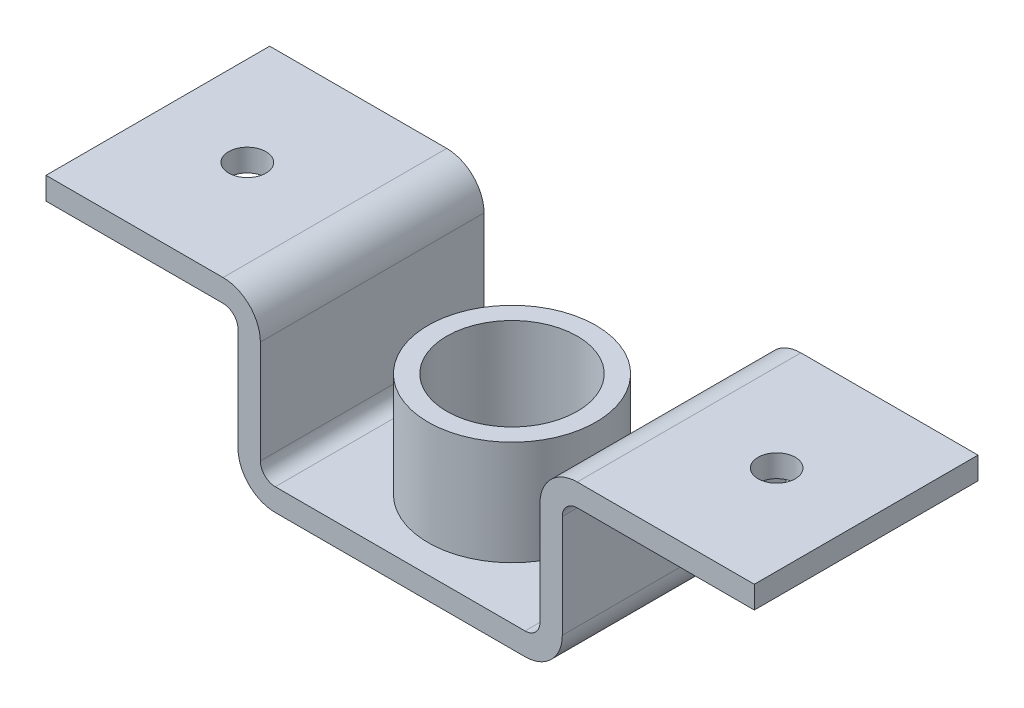
ISO-10303-21;
HEADER;
FILE_DESCRIPTION(('STEP AP214'),'2;1');
FILE_NAME('part.step','',(''),(''),'','','');
FILE_SCHEMA(('AUTOMOTIVE_DESIGN { 1 0 10303 214 1 1 1 1 }'));
ENDSEC;
DATA;
#1=APPLICATION_CONTEXT('core data for automotive mechanical design processes');
#2=APPLICATION_PROTOCOL_DEFINITION('international standard','automotive_design',2000,#1);
#3=PRODUCT_CONTEXT('',#1,'mechanical');
#4=PRODUCT('Part','Part','',(#3));
#5=PRODUCT_RELATED_PRODUCT_CATEGORY('part','',(#4));
#6=PRODUCT_DEFINITION_FORMATION('','',#4);
#7=PRODUCT_DEFINITION_CONTEXT('part definition',#1,'design');
#8=PRODUCT_DEFINITION('design','',#6,#7);
#9=PRODUCT_DEFINITION_SHAPE('','',#8);
#10=(LENGTH_UNIT() NAMED_UNIT(*) SI_UNIT(.MILLI.,.METRE.));
#11=(NAMED_UNIT(*) PLANE_ANGLE_UNIT() SI_UNIT($,.RADIAN.));
#12=(NAMED_UNIT(*) SI_UNIT($,.STERADIAN.) SOLID_ANGLE_UNIT());
#13=UNCERTAINTY_MEASURE_WITH_UNIT(LENGTH_MEASURE(1.E-05),#10,'distance_accuracy_value','');
#14=(GEOMETRIC_REPRESENTATION_CONTEXT(3) GLOBAL_UNCERTAINTY_ASSIGNED_CONTEXT((#13)) GLOBAL_UNIT_ASSIGNED_CONTEXT((#10,
#11,#12)) REPRESENTATION_CONTEXT('',''));
#15=CARTESIAN_POINT('',(0.,0.,0.));
#16=DIRECTION('',(0.,0.,1.));
#17=DIRECTION('',(1.,0.,0.));
#18=AXIS2_PLACEMENT_3D('',#15,#16,#17);
#19=CARTESIAN_POINT('',(0.,-30.,300.));
#20=DIRECTION('',(1.,0.,0.));
#21=DIRECTION('',(0.,0.,-1.));
#22=AXIS2_PLACEMENT_3D('',#19,#20,#21);
#23=PLANE('',#22);
#24=DIRECTION('',(0.,-1.,0.));
#25=VECTOR('',#24,1.);
#26=CARTESIAN_POINT('',(0.,-30.,0.));
#27=LINE('',#26,#25);
#28=CARTESIAN_POINT('',(0.,0.,0.));
#29=VERTEX_POINT('',#28);
#30=CARTESIAN_POINT('',(0.,-30.,0.));
#31=VERTEX_POINT('',#30);
#32=EDGE_CURVE('E213',#29,#31,#27,.T.);
#33=ORIENTED_EDGE('',*,*,#32,.T.);
#34=DIRECTION('',(0.,0.,-1.));
#35=VECTOR('',#34,1.);
#36=CARTESIAN_POINT('',(0.,-30.,300.));
#37=LINE('',#36,#35);
#38=CARTESIAN_POINT('',(0.,-30.,300.));
#39=VERTEX_POINT('',#38);
#40=EDGE_CURVE('E52',#39,#31,#37,.T.);
#41=ORIENTED_EDGE('',*,*,#40,.F.);
#42=DIRECTION('',(0.,-1.,0.));
#43=VECTOR('',#42,1.);
#44=CARTESIAN_POINT('',(0.,-30.,300.));
#45=LINE('',#44,#43);
#46=CARTESIAN_POINT('',(0.,0.,300.));
#47=VERTEX_POINT('',#46);
#48=EDGE_CURVE('E252',#47,#39,#45,.T.);
#49=ORIENTED_EDGE('',*,*,#48,.F.);
#50=DIRECTION('',(0.,0.,-1.));
#51=VECTOR('',#50,1.);
#52=CARTESIAN_POINT('',(0.,0.,300.));
#53=LINE('',#52,#51);
#54=EDGE_CURVE('E209',#47,#29,#53,.T.);
#55=ORIENTED_EDGE('',*,*,#54,.T.);
#56=EDGE_LOOP('',(#33,#41,#49,#55));
#57=FACE_BOUND('',#56,.T.);
#58=ADVANCED_FACE('F43',(#57),#23,.F.);
#59=CARTESIAN_POINT('',(0.,-30.,300.));
#60=DIRECTION('',(0.,1.,0.));
#61=DIRECTION('',(0.,0.,1.));
#62=AXIS2_PLACEMENT_3D('',#59,#60,#61);
#63=PLANE('',#62);
#64=CARTESIAN_POINT('',(120.,-30.,150.));
#65=DIRECTION('',(0.,1.,0.));
#66=DIRECTION('',(0.,0.,1.));
#67=AXIS2_PLACEMENT_3D('',#64,#65,#66);
#68=CIRCLE('',#67,25.);
#69=CARTESIAN_POINT('',(120.,-30.,125.));
#70=VERTEX_POINT('',#69);
#71=EDGE_CURVE('E603',#70,#70,#68,.T.);
#72=ORIENTED_EDGE('',*,*,#71,.T.);
#73=EDGE_LOOP('',(#72));
#74=FACE_BOUND('',#73,.T.);
#75=DIRECTION('',(1.,0.,0.));
#76=VECTOR('',#75,1.);
#77=CARTESIAN_POINT('',(0.,-30.,0.));
#78=LINE('',#77,#76);
#79=CARTESIAN_POINT('',(237.5,-30.,0.));
#80=VERTEX_POINT('',#79);
#81=EDGE_CURVE('E216',#31,#80,#78,.T.);
#82=ORIENTED_EDGE('',*,*,#81,.T.);
#83=DIRECTION('',(0.,0.,-1.));
#84=VECTOR('',#83,1.);
#85=CARTESIAN_POINT('',(237.5,-30.,300.));
#86=LINE('',#85,#84);
#87=CARTESIAN_POINT('',(237.5,-30.,300.));
#88=VERTEX_POINT('',#87);
#89=EDGE_CURVE('E298',#88,#80,#86,.T.);
#90=ORIENTED_EDGE('',*,*,#89,.F.);
#91=DIRECTION('',(1.,0.,0.));
#92=VECTOR('',#91,1.);
#93=CARTESIAN_POINT('',(0.,-30.,300.));
#94=LINE('',#93,#92);
#95=EDGE_CURVE('E140',#39,#88,#94,.T.);
#96=ORIENTED_EDGE('',*,*,#95,.F.);
#97=ORIENTED_EDGE('',*,*,#40,.T.);
#98=EDGE_LOOP('',(#82,#90,#96,#97));
#99=FACE_BOUND('',#98,.T.);
#100=ADVANCED_FACE('F375',(#74,#99),#63,.F.);
#101=CARTESIAN_POINT('',(237.5,-50.,300.));
#102=DIRECTION('',(0.,0.,-1.));
#103=DIRECTION('',(-1.,0.,0.));
#104=AXIS2_PLACEMENT_3D('',#101,#102,#103);
#105=CYLINDRICAL_SURFACE('',#104,20.);
#106=CARTESIAN_POINT('',(237.5,-50.,0.));
#107=DIRECTION('',(0.,0.,-1.));
#108=DIRECTION('',(-1.,0.,0.));
#109=AXIS2_PLACEMENT_3D('',#106,#107,#108);
#110=CIRCLE('',#109,20.);
#111=CARTESIAN_POINT('',(257.5,-50.,0.));
#112=VERTEX_POINT('',#111);
#113=EDGE_CURVE('E219',#80,#112,#110,.T.);
#114=ORIENTED_EDGE('',*,*,#113,.T.);
#115=DIRECTION('',(0.,0.,-1.));
#116=VECTOR('',#115,1.);
#117=CARTESIAN_POINT('',(257.5,-50.,300.));
#118=LINE('',#117,#116);
#119=CARTESIAN_POINT('',(257.5,-50.,300.));
#120=VERTEX_POINT('',#119);
#121=EDGE_CURVE('E295',#120,#112,#118,.T.);
#122=ORIENTED_EDGE('',*,*,#121,.F.);
#123=CARTESIAN_POINT('',(237.5,-50.,300.));
#124=DIRECTION('',(0.,0.,-1.));
#125=DIRECTION('',(-1.,0.,0.));
#126=AXIS2_PLACEMENT_3D('',#123,#124,#125);
#127=CIRCLE('',#126,20.);
#128=EDGE_CURVE('E318',#88,#120,#127,.T.);
#129=ORIENTED_EDGE('',*,*,#128,.F.);
#130=ORIENTED_EDGE('',*,*,#89,.T.);
#131=EDGE_LOOP('',(#114,#122,#129,#130));
#132=FACE_BOUND('',#131,.T.);
#133=ADVANCED_FACE('F379',(#132),#105,.F.);
#134=CARTESIAN_POINT('',(257.5,-50.,300.));
#135=DIRECTION('',(1.,0.,0.));
#136=DIRECTION('',(0.,0.,-1.));
#137=AXIS2_PLACEMENT_3D('',#134,#135,#136);
#138=PLANE('',#137);
#139=DIRECTION('',(0.,-1.,0.));
#140=VECTOR('',#139,1.);
#141=CARTESIAN_POINT('',(257.5,-50.,0.));
#142=LINE('',#141,#140);
#143=CARTESIAN_POINT('',(257.5,-188.,0.));
#144=VERTEX_POINT('',#143);
#145=EDGE_CURVE('E221',#112,#144,#142,.T.);
#146=ORIENTED_EDGE('',*,*,#145,.T.);
#147=DIRECTION('',(0.,0.,-1.));
#148=VECTOR('',#147,1.);
#149=CARTESIAN_POINT('',(257.5,-188.,300.));
#150=LINE('',#149,#148);
#151=CARTESIAN_POINT('',(257.5,-188.,300.));
#152=VERTEX_POINT('',#151);
#153=EDGE_CURVE('E292',#152,#144,#150,.T.);
#154=ORIENTED_EDGE('',*,*,#153,.F.);
#155=DIRECTION('',(0.,-1.,0.));
#156=VECTOR('',#155,1.);
#157=CARTESIAN_POINT('',(257.5,-50.,300.));
#158=LINE('',#157,#156);
#159=EDGE_CURVE('E320',#120,#152,#158,.T.);
#160=ORIENTED_EDGE('',*,*,#159,.F.);
#161=ORIENTED_EDGE('',*,*,#121,.T.);
#162=EDGE_LOOP('',(#146,#154,#160,#161));
#163=FACE_BOUND('',#162,.T.);
#164=ADVANCED_FACE('F384',(#163),#138,.F.);
#165=CARTESIAN_POINT('',(307.5,-188.,300.));
#166=DIRECTION('',(0.,0.,-1.));
#167=DIRECTION('',(-1.,0.,0.));
#168=AXIS2_PLACEMENT_3D('',#165,#166,#167);
#169=CYLINDRICAL_SURFACE('',#168,50.);
#170=CARTESIAN_POINT('',(307.5,-188.,0.));
#171=DIRECTION('',(0.,0.,1.));
#172=DIRECTION('',(1.,0.,0.));
#173=AXIS2_PLACEMENT_3D('',#170,#171,#172);
#174=CIRCLE('',#173,50.);
#175=CARTESIAN_POINT('',(307.5,-238.,0.));
#176=VERTEX_POINT('',#175);
#177=EDGE_CURVE('E223',#144,#176,#174,.T.);
#178=ORIENTED_EDGE('',*,*,#177,.T.);
#179=DIRECTION('',(0.,0.,-1.));
#180=VECTOR('',#179,1.);
#181=CARTESIAN_POINT('',(307.5,-238.,300.));
#182=LINE('',#181,#180);
#183=CARTESIAN_POINT('',(307.5,-238.,300.));
#184=VERTEX_POINT('',#183);
#185=EDGE_CURVE('E289',#184,#176,#182,.T.);
#186=ORIENTED_EDGE('',*,*,#185,.F.);
#187=CARTESIAN_POINT('',(307.5,-188.,300.));
#188=DIRECTION('',(0.,0.,1.));
#189=DIRECTION('',(1.,0.,0.));
#190=AXIS2_PLACEMENT_3D('',#187,#188,#189);
#191=CIRCLE('',#190,50.);
#192=EDGE_CURVE('E322',#152,#184,#191,.T.);
#193=ORIENTED_EDGE('',*,*,#192,.F.);
#194=ORIENTED_EDGE('',*,*,#153,.T.);
#195=EDGE_LOOP('',(#178,#186,#193,#194));
#196=FACE_BOUND('',#195,.T.);
#197=ADVANCED_FACE('F391',(#196),#169,.T.);
#198=CARTESIAN_POINT('',(307.5,-238.,300.));
#199=DIRECTION('',(0.,1.,0.));
#200=DIRECTION('',(0.,0.,1.));
#201=AXIS2_PLACEMENT_3D('',#198,#199,#200);
#202=PLANE('',#201);
#203=CARTESIAN_POINT('',(475.,-238.,150.));
#204=DIRECTION('',(0.,-1.,0.));
#205=DIRECTION('',(0.,0.,-1.));
#206=AXIS2_PLACEMENT_3D('',#203,#204,#205);
#207=CIRCLE('',#206,37.5);
#208=CARTESIAN_POINT('',(475.,-238.,112.5));
#209=VERTEX_POINT('',#208);
#210=EDGE_CURVE('E606',#209,#209,#207,.T.);
#211=ORIENTED_EDGE('',*,*,#210,.F.);
#212=EDGE_LOOP('',(#211));
#213=FACE_BOUND('',#212,.T.);
#214=DIRECTION('',(1.,0.,0.));
#215=VECTOR('',#214,1.);
#216=CARTESIAN_POINT('',(307.5,-238.,0.));
#217=LINE('',#216,#215);
#218=CARTESIAN_POINT('',(642.5,-238.,0.));
#219=VERTEX_POINT('',#218);
#220=EDGE_CURVE('E225',#176,#219,#217,.T.);
#221=ORIENTED_EDGE('',*,*,#220,.T.);
#222=DIRECTION('',(0.,0.,-1.));
#223=VECTOR('',#222,1.);
#224=CARTESIAN_POINT('',(642.5,-238.,300.));
#225=LINE('',#224,#223);
#226=CARTESIAN_POINT('',(642.5,-238.,300.));
#227=VERTEX_POINT('',#226);
#228=EDGE_CURVE('E286',#227,#219,#225,.T.);
#229=ORIENTED_EDGE('',*,*,#228,.F.);
#230=DIRECTION('',(1.,0.,0.));
#231=VECTOR('',#230,1.);
#232=CARTESIAN_POINT('',(307.5,-238.,300.));
#233=LINE('',#232,#231);
#234=EDGE_CURVE('E324',#184,#227,#233,.T.);
#235=ORIENTED_EDGE('',*,*,#234,.F.);
#236=ORIENTED_EDGE('',*,*,#185,.T.);
#237=EDGE_LOOP('',(#221,#229,#235,#236));
#238=FACE_BOUND('',#237,.T.);
#239=ADVANCED_FACE('F395',(#213,#238),#202,.F.);
#240=CARTESIAN_POINT('',(642.5,-188.,300.));
#241=DIRECTION('',(0.,0.,-1.));
#242=DIRECTION('',(-1.,0.,0.));
#243=AXIS2_PLACEMENT_3D('',#240,#241,#242);
#244=CYLINDRICAL_SURFACE('',#243,50.);
#245=CARTESIAN_POINT('',(642.5,-188.,0.));
#246=DIRECTION('',(0.,0.,1.));
#247=DIRECTION('',(1.,0.,0.));
#248=AXIS2_PLACEMENT_3D('',#245,#246,#247);
#249=CIRCLE('',#248,50.);
#250=CARTESIAN_POINT('',(692.5,-188.,0.));
#251=VERTEX_POINT('',#250);
#252=EDGE_CURVE('E227',#219,#251,#249,.T.);
#253=ORIENTED_EDGE('',*,*,#252,.T.);
#254=DIRECTION('',(0.,0.,-1.));
#255=VECTOR('',#254,1.);
#256=CARTESIAN_POINT('',(692.5,-188.,300.));
#257=LINE('',#256,#255);
#258=CARTESIAN_POINT('',(692.5,-188.,300.));
#259=VERTEX_POINT('',#258);
#260=EDGE_CURVE('E283',#259,#251,#257,.T.);
#261=ORIENTED_EDGE('',*,*,#260,.F.);
#262=CARTESIAN_POINT('',(642.5,-188.,300.));
#263=DIRECTION('',(0.,0.,1.));
#264=DIRECTION('',(1.,0.,0.));
#265=AXIS2_PLACEMENT_3D('',#262,#263,#264);
#266=CIRCLE('',#265,50.);
#267=EDGE_CURVE('E326',#227,#259,#266,.T.);
#268=ORIENTED_EDGE('',*,*,#267,.F.);
#269=ORIENTED_EDGE('',*,*,#228,.T.);
#270=EDGE_LOOP('',(#253,#261,#268,#269));
#271=FACE_BOUND('',#270,.T.);
#272=ADVANCED_FACE('F399',(#271),#244,.T.);
#273=CARTESIAN_POINT('',(692.5,-188.,300.));
#274=DIRECTION('',(-1.,0.,0.));
#275=DIRECTION('',(0.,0.,1.));
#276=AXIS2_PLACEMENT_3D('',#273,#274,#275);
#277=PLANE('',#276);
#278=DIRECTION('',(0.,1.,0.));
#279=VECTOR('',#278,1.);
#280=CARTESIAN_POINT('',(692.5,-188.,0.));
#281=LINE('',#280,#279);
#282=CARTESIAN_POINT('',(692.5,-50.,0.));
#283=VERTEX_POINT('',#282);
#284=EDGE_CURVE('E229',#251,#283,#281,.T.);
#285=ORIENTED_EDGE('',*,*,#284,.T.);
#286=DIRECTION('',(0.,0.,-1.));
#287=VECTOR('',#286,1.);
#288=CARTESIAN_POINT('',(692.5,-50.,300.));
#289=LINE('',#288,#287);
#290=CARTESIAN_POINT('',(692.5,-50.,300.));
#291=VERTEX_POINT('',#290);
#292=EDGE_CURVE('E280',#291,#283,#289,.T.);
#293=ORIENTED_EDGE('',*,*,#292,.F.);
#294=DIRECTION('',(0.,1.,0.));
#295=VECTOR('',#294,1.);
#296=CARTESIAN_POINT('',(692.5,-188.,300.));
#297=LINE('',#296,#295);
#298=EDGE_CURVE('E328',#259,#291,#297,.T.);
#299=ORIENTED_EDGE('',*,*,#298,.F.);
#300=ORIENTED_EDGE('',*,*,#260,.T.);
#301=EDGE_LOOP('',(#285,#293,#299,#300));
#302=FACE_BOUND('',#301,.T.);
#303=ADVANCED_FACE('F403',(#302),#277,.F.);
#304=CARTESIAN_POINT('',(712.5,-50.,300.));
#305=DIRECTION('',(0.,0.,-1.));
#306=DIRECTION('',(-1.,0.,0.));
#307=AXIS2_PLACEMENT_3D('',#304,#305,#306);
#308=CYLINDRICAL_SURFACE('',#307,20.);
#309=CARTESIAN_POINT('',(712.5,-50.,0.));
#310=DIRECTION('',(0.,0.,-1.));
#311=DIRECTION('',(-1.,0.,0.));
#312=AXIS2_PLACEMENT_3D('',#309,#310,#311);
#313=CIRCLE('',#312,20.);
#314=CARTESIAN_POINT('',(712.5,-30.,0.));
#315=VERTEX_POINT('',#314);
#316=EDGE_CURVE('E231',#283,#315,#313,.T.);
#317=ORIENTED_EDGE('',*,*,#316,.T.);
#318=DIRECTION('',(0.,0.,-1.));
#319=VECTOR('',#318,1.);
#320=CARTESIAN_POINT('',(712.5,-30.,300.));
#321=LINE('',#320,#319);
#322=CARTESIAN_POINT('',(712.5,-30.,300.));
#323=VERTEX_POINT('',#322);
#324=EDGE_CURVE('E277',#323,#315,#321,.T.);
#325=ORIENTED_EDGE('',*,*,#324,.F.);
#326=CARTESIAN_POINT('',(712.5,-50.,300.));
#327=DIRECTION('',(0.,0.,-1.));
#328=DIRECTION('',(-1.,0.,0.));
#329=AXIS2_PLACEMENT_3D('',#326,#327,#328);
#330=CIRCLE('',#329,20.);
#331=EDGE_CURVE('E330',#291,#323,#330,.T.);
#332=ORIENTED_EDGE('',*,*,#331,.F.);
#333=ORIENTED_EDGE('',*,*,#292,.T.);
#334=EDGE_LOOP('',(#317,#325,#332,#333));
#335=FACE_BOUND('',#334,.T.);
#336=ADVANCED_FACE('F407',(#335),#308,.F.);
#337=CARTESIAN_POINT('',(712.5,-30.,300.));
#338=DIRECTION('',(0.,1.,0.));
#339=DIRECTION('',(0.,0.,1.));
#340=AXIS2_PLACEMENT_3D('',#337,#338,#339);
#341=PLANE('',#340);
#342=CARTESIAN_POINT('',(830.,-30.,150.));
#343=DIRECTION('',(0.,1.,0.));
#344=DIRECTION('',(0.,0.,1.));
#345=AXIS2_PLACEMENT_3D('',#342,#343,#344);
#346=CIRCLE('',#345,25.);
#347=CARTESIAN_POINT('',(830.,-30.,125.));
#348=VERTEX_POINT('',#347);
#349=EDGE_CURVE('E312',#348,#348,#346,.T.);
#350=ORIENTED_EDGE('',*,*,#349,.T.);
#351=EDGE_LOOP('',(#350));
#352=FACE_BOUND('',#351,.T.);
#353=DIRECTION('',(1.,0.,0.));
#354=VECTOR('',#353,1.);
#355=CARTESIAN_POINT('',(712.5,-30.,0.));
#356=LINE('',#355,#354);
#357=CARTESIAN_POINT('',(950.,-30.,0.));
#358=VERTEX_POINT('',#357);
#359=EDGE_CURVE('E233',#315,#358,#356,.T.);
#360=ORIENTED_EDGE('',*,*,#359,.T.);
#361=DIRECTION('',(0.,0.,-1.));
#362=VECTOR('',#361,1.);
#363=CARTESIAN_POINT('',(950.,-30.,300.));
#364=LINE('',#363,#362);
#365=CARTESIAN_POINT('',(950.,-30.,300.));
#366=VERTEX_POINT('',#365);
#367=EDGE_CURVE('E274',#366,#358,#364,.T.);
#368=ORIENTED_EDGE('',*,*,#367,.F.);
#369=DIRECTION('',(1.,0.,0.));
#370=VECTOR('',#369,1.);
#371=CARTESIAN_POINT('',(712.5,-30.,300.));
#372=LINE('',#371,#370);
#373=EDGE_CURVE('E332',#323,#366,#372,.T.);
#374=ORIENTED_EDGE('',*,*,#373,.F.);
#375=ORIENTED_EDGE('',*,*,#324,.T.);
#376=EDGE_LOOP('',(#360,#368,#374,#375));
#377=FACE_BOUND('',#376,.T.);
#378=ADVANCED_FACE('F411',(#352,#377),#341,.F.);
#379=CARTESIAN_POINT('',(950.,-30.,300.));
#380=DIRECTION('',(-1.,0.,0.));
#381=DIRECTION('',(0.,0.,1.));
#382=AXIS2_PLACEMENT_3D('',#379,#380,#381);
#383=PLANE('',#382);
#384=DIRECTION('',(0.,1.,0.));
#385=VECTOR('',#384,1.);
#386=CARTESIAN_POINT('',(950.,-30.,0.));
#387=LINE('',#386,#385);
#388=CARTESIAN_POINT('',(950.,0.,0.));
#389=VERTEX_POINT('',#388);
#390=EDGE_CURVE('E235',#358,#389,#387,.T.);
#391=ORIENTED_EDGE('',*,*,#390,.T.);
#392=DIRECTION('',(0.,0.,-1.));
#393=VECTOR('',#392,1.);
#394=CARTESIAN_POINT('',(950.,0.,300.));
#395=LINE('',#394,#393);
#396=CARTESIAN_POINT('',(950.,0.,300.));
#397=VERTEX_POINT('',#396);
#398=EDGE_CURVE('E271',#397,#389,#395,.T.);
#399=ORIENTED_EDGE('',*,*,#398,.F.);
#400=DIRECTION('',(0.,1.,0.));
#401=VECTOR('',#400,1.);
#402=CARTESIAN_POINT('',(950.,-30.,300.));
#403=LINE('',#402,#401);
#404=EDGE_CURVE('E334',#366,#397,#403,.T.);
#405=ORIENTED_EDGE('',*,*,#404,.F.);
#406=ORIENTED_EDGE('',*,*,#367,.T.);
#407=EDGE_LOOP('',(#391,#399,#405,#406));
#408=FACE_BOUND('',#407,.T.);
#409=ADVANCED_FACE('F415',(#408),#383,.F.);
#410=CARTESIAN_POINT('',(712.5,0.,300.));
#411=DIRECTION('',(0.,-1.,0.));
#412=DIRECTION('',(0.,0.,-1.));
#413=AXIS2_PLACEMENT_3D('',#410,#411,#412);
#414=PLANE('',#413);
#415=CARTESIAN_POINT('',(830.,0.,150.));
#416=DIRECTION('',(0.,-1.,0.));
#417=DIRECTION('',(0.,0.,-1.));
#418=AXIS2_PLACEMENT_3D('',#415,#416,#417);
#419=CIRCLE('',#418,25.);
#420=CARTESIAN_POINT('',(830.,0.,125.));
#421=VERTEX_POINT('',#420);
#422=EDGE_CURVE('E600',#421,#421,#419,.T.);
#423=ORIENTED_EDGE('',*,*,#422,.T.);
#424=EDGE_LOOP('',(#423));
#425=FACE_BOUND('',#424,.T.);
#426=DIRECTION('',(-1.,0.,0.));
#427=VECTOR('',#426,1.);
#428=CARTESIAN_POINT('',(712.5,0.,0.));
#429=LINE('',#428,#427);
#430=CARTESIAN_POINT('',(712.5,0.,0.));
#431=VERTEX_POINT('',#430);
#432=EDGE_CURVE('E237',#389,#431,#429,.T.);
#433=ORIENTED_EDGE('',*,*,#432,.T.);
#434=DIRECTION('',(0.,0.,-1.));
#435=VECTOR('',#434,1.);
#436=CARTESIAN_POINT('',(712.5,0.,300.));
#437=LINE('',#436,#435);
#438=CARTESIAN_POINT('',(712.5,0.,300.));
#439=VERTEX_POINT('',#438);
#440=EDGE_CURVE('E268',#439,#431,#437,.T.);
#441=ORIENTED_EDGE('',*,*,#440,.F.);
#442=DIRECTION('',(-1.,0.,0.));
#443=VECTOR('',#442,1.);
#444=CARTESIAN_POINT('',(712.5,0.,300.));
#445=LINE('',#444,#443);
#446=EDGE_CURVE('E336',#397,#439,#445,.T.);
#447=ORIENTED_EDGE('',*,*,#446,.F.);
#448=ORIENTED_EDGE('',*,*,#398,.T.);
#449=EDGE_LOOP('',(#433,#441,#447,#448));
#450=FACE_BOUND('',#449,.T.);
#451=ADVANCED_FACE('F419',(#425,#450),#414,.F.);
#452=CARTESIAN_POINT('',(712.5,-50.,300.));
#453=DIRECTION('',(0.,0.,-1.));
#454=DIRECTION('',(-1.,0.,0.));
#455=AXIS2_PLACEMENT_3D('',#452,#453,#454);
#456=CYLINDRICAL_SURFACE('',#455,50.);
#457=CARTESIAN_POINT('',(712.5,-50.,0.));
#458=DIRECTION('',(0.,0.,1.));
#459=DIRECTION('',(-1.,0.,0.));
#460=AXIS2_PLACEMENT_3D('',#457,#458,#459);
#461=CIRCLE('',#460,50.);
#462=CARTESIAN_POINT('',(662.5,-50.,0.));
#463=VERTEX_POINT('',#462);
#464=EDGE_CURVE('E239',#431,#463,#461,.T.);
#465=ORIENTED_EDGE('',*,*,#464,.T.);
#466=DIRECTION('',(0.,0.,-1.));
#467=VECTOR('',#466,1.);
#468=CARTESIAN_POINT('',(662.5,-50.,300.));
#469=LINE('',#468,#467);
#470=CARTESIAN_POINT('',(662.5,-50.,300.));
#471=VERTEX_POINT('',#470);
#472=EDGE_CURVE('E265',#471,#463,#469,.T.);
#473=ORIENTED_EDGE('',*,*,#472,.F.);
#474=CARTESIAN_POINT('',(712.5,-50.,300.));
#475=DIRECTION('',(0.,0.,1.));
#476=DIRECTION('',(-1.,0.,0.));
#477=AXIS2_PLACEMENT_3D('',#474,#475,#476);
#478=CIRCLE('',#477,50.);
#479=EDGE_CURVE('E338',#439,#471,#478,.T.);
#480=ORIENTED_EDGE('',*,*,#479,.F.);
#481=ORIENTED_EDGE('',*,*,#440,.T.);
#482=EDGE_LOOP('',(#465,#473,#480,#481));
#483=FACE_BOUND('',#482,.T.);
#484=ADVANCED_FACE('F423',(#483),#456,.T.);
#485=CARTESIAN_POINT('',(662.5,-188.,300.));
#486=DIRECTION('',(1.,0.,0.));
#487=DIRECTION('',(0.,0.,-1.));
#488=AXIS2_PLACEMENT_3D('',#485,#486,#487);
#489=PLANE('',#488);
#490=DIRECTION('',(0.,-1.,0.));
#491=VECTOR('',#490,1.);
#492=CARTESIAN_POINT('',(662.5,-188.,0.));
#493=LINE('',#492,#491);
#494=CARTESIAN_POINT('',(662.5,-188.,0.));
#495=VERTEX_POINT('',#494);
#496=EDGE_CURVE('E241',#463,#495,#493,.T.);
#497=ORIENTED_EDGE('',*,*,#496,.T.);
#498=DIRECTION('',(0.,0.,-1.));
#499=VECTOR('',#498,1.);
#500=CARTESIAN_POINT('',(662.5,-188.,300.));
#501=LINE('',#500,#499);
#502=CARTESIAN_POINT('',(662.5,-188.,300.));
#503=VERTEX_POINT('',#502);
#504=EDGE_CURVE('E262',#503,#495,#501,.T.);
#505=ORIENTED_EDGE('',*,*,#504,.F.);
#506=DIRECTION('',(0.,-1.,0.));
#507=VECTOR('',#506,1.);
#508=CARTESIAN_POINT('',(662.5,-188.,300.));
#509=LINE('',#508,#507);
#510=EDGE_CURVE('E340',#471,#503,#509,.T.);
#511=ORIENTED_EDGE('',*,*,#510,.F.);
#512=ORIENTED_EDGE('',*,*,#472,.T.);
#513=EDGE_LOOP('',(#497,#505,#511,#512));
#514=FACE_BOUND('',#513,.T.);
#515=ADVANCED_FACE('F427',(#514),#489,.F.);
#516=CARTESIAN_POINT('',(642.5,-188.,300.));
#517=DIRECTION('',(0.,0.,-1.));
#518=DIRECTION('',(-1.,0.,0.));
#519=AXIS2_PLACEMENT_3D('',#516,#517,#518);
#520=CYLINDRICAL_SURFACE('',#519,20.);
#521=CARTESIAN_POINT('',(642.5,-188.,0.));
#522=DIRECTION('',(0.,0.,-1.));
#523=DIRECTION('',(1.,0.,0.));
#524=AXIS2_PLACEMENT_3D('',#521,#522,#523);
#525=CIRCLE('',#524,20.);
#526=CARTESIAN_POINT('',(642.5,-208.,0.));
#527=VERTEX_POINT('',#526);
#528=EDGE_CURVE('E243',#495,#527,#525,.T.);
#529=ORIENTED_EDGE('',*,*,#528,.T.);
#530=DIRECTION('',(0.,0.,-1.));
#531=VECTOR('',#530,1.);
#532=CARTESIAN_POINT('',(642.5,-208.,300.));
#533=LINE('',#532,#531);
#534=CARTESIAN_POINT('',(642.5,-208.,300.));
#535=VERTEX_POINT('',#534);
#536=EDGE_CURVE('E259',#535,#527,#533,.T.);
#537=ORIENTED_EDGE('',*,*,#536,.F.);
#538=CARTESIAN_POINT('',(642.5,-188.,300.));
#539=DIRECTION('',(0.,0.,-1.));
#540=DIRECTION('',(1.,0.,0.));
#541=AXIS2_PLACEMENT_3D('',#538,#539,#540);
#542=CIRCLE('',#541,20.);
#543=EDGE_CURVE('E342',#503,#535,#542,.T.);
#544=ORIENTED_EDGE('',*,*,#543,.F.);
#545=ORIENTED_EDGE('',*,*,#504,.T.);
#546=EDGE_LOOP('',(#529,#537,#544,#545));
#547=FACE_BOUND('',#546,.T.);
#548=ADVANCED_FACE('F431',(#547),#520,.F.);
#549=CARTESIAN_POINT('',(307.5,-208.,300.));
#550=DIRECTION('',(0.,-1.,0.));
#551=DIRECTION('',(0.,0.,-1.));
#552=AXIS2_PLACEMENT_3D('',#549,#550,#551);
#553=PLANE('',#552);
#554=CARTESIAN_POINT('',(475.,-208.,150.));
#555=DIRECTION('',(0.,-1.,0.));
#556=DIRECTION('',(0.,0.,-1.));
#557=AXIS2_PLACEMENT_3D('',#554,#555,#556);
#558=CIRCLE('',#557,112.5);
#559=CARTESIAN_POINT('',(475.,-208.,37.5));
#560=VERTEX_POINT('',#559);
#561=EDGE_CURVE('E12',#560,#560,#558,.F.);
#562=ORIENTED_EDGE('',*,*,#561,.F.);
#563=EDGE_LOOP('',(#562));
#564=FACE_BOUND('',#563,.T.);
#565=DIRECTION('',(-1.,0.,0.));
#566=VECTOR('',#565,1.);
#567=CARTESIAN_POINT('',(307.5,-208.,0.));
#568=LINE('',#567,#566);
#569=CARTESIAN_POINT('',(307.5,-208.,0.));
#570=VERTEX_POINT('',#569);
#571=EDGE_CURVE('E245',#527,#570,#568,.T.);
#572=ORIENTED_EDGE('',*,*,#571,.T.);
#573=DIRECTION('',(0.,0.,-1.));
#574=VECTOR('',#573,1.);
#575=CARTESIAN_POINT('',(307.5,-208.,300.));
#576=LINE('',#575,#574);
#577=CARTESIAN_POINT('',(307.5,-208.,300.));
#578=VERTEX_POINT('',#577);
#579=EDGE_CURVE('E256',#578,#570,#576,.T.);
#580=ORIENTED_EDGE('',*,*,#579,.F.);
#581=DIRECTION('',(-1.,0.,0.));
#582=VECTOR('',#581,1.);
#583=CARTESIAN_POINT('',(307.5,-208.,300.));
#584=LINE('',#583,#582);
#585=EDGE_CURVE('E344',#535,#578,#584,.T.);
#586=ORIENTED_EDGE('',*,*,#585,.F.);
#587=ORIENTED_EDGE('',*,*,#536,.T.);
#588=EDGE_LOOP('',(#572,#580,#586,#587));
#589=FACE_BOUND('',#588,.T.);
#590=ADVANCED_FACE('F350',(#564,#589),#553,.F.);
#591=CARTESIAN_POINT('',(307.5,-188.,300.));
#592=DIRECTION('',(0.,0.,-1.));
#593=DIRECTION('',(-1.,0.,0.));
#594=AXIS2_PLACEMENT_3D('',#591,#592,#593);
#595=CYLINDRICAL_SURFACE('',#594,20.);
#596=CARTESIAN_POINT('',(307.5,-188.,0.));
#597=DIRECTION('',(0.,0.,-1.));
#598=DIRECTION('',(1.,0.,0.));
#599=AXIS2_PLACEMENT_3D('',#596,#597,#598);
#600=CIRCLE('',#599,20.);
#601=CARTESIAN_POINT('',(287.5,-188.,0.));
#602=VERTEX_POINT('',#601);
#603=EDGE_CURVE('E247',#570,#602,#600,.T.);
#604=ORIENTED_EDGE('',*,*,#603,.T.);
#605=DIRECTION('',(0.,0.,-1.));
#606=VECTOR('',#605,1.);
#607=CARTESIAN_POINT('',(287.5,-188.,300.));
#608=LINE('',#607,#606);
#609=CARTESIAN_POINT('',(287.5,-188.,300.));
#610=VERTEX_POINT('',#609);
#611=EDGE_CURVE('E204',#610,#602,#608,.T.);
#612=ORIENTED_EDGE('',*,*,#611,.F.);
#613=CARTESIAN_POINT('',(307.5,-188.,300.));
#614=DIRECTION('',(0.,0.,-1.));
#615=DIRECTION('',(1.,0.,0.));
#616=AXIS2_PLACEMENT_3D('',#613,#614,#615);
#617=CIRCLE('',#616,20.);
#618=EDGE_CURVE('E195',#578,#610,#617,.T.);
#619=ORIENTED_EDGE('',*,*,#618,.F.);
#620=ORIENTED_EDGE('',*,*,#579,.T.);
#621=EDGE_LOOP('',(#604,#612,#619,#620));
#622=FACE_BOUND('',#621,.T.);
#623=ADVANCED_FACE('F354',(#622),#595,.F.);
#624=CARTESIAN_POINT('',(287.5,-50.,300.));
#625=DIRECTION('',(-1.,0.,0.));
#626=DIRECTION('',(0.,0.,1.));
#627=AXIS2_PLACEMENT_3D('',#624,#625,#626);
#628=PLANE('',#627);
#629=DIRECTION('',(0.,1.,0.));
#630=VECTOR('',#629,1.);
#631=CARTESIAN_POINT('',(287.5,-50.,0.));
#632=LINE('',#631,#630);
#633=CARTESIAN_POINT('',(287.5,-50.,0.));
#634=VERTEX_POINT('',#633);
#635=EDGE_CURVE('E203',#602,#634,#632,.T.);
#636=ORIENTED_EDGE('',*,*,#635,.T.);
#637=DIRECTION('',(0.,0.,-1.));
#638=VECTOR('',#637,1.);
#639=CARTESIAN_POINT('',(287.5,-50.,300.));
#640=LINE('',#639,#638);
#641=CARTESIAN_POINT('',(287.5,-50.,300.));
#642=VERTEX_POINT('',#641);
#643=EDGE_CURVE('E200',#642,#634,#640,.T.);
#644=ORIENTED_EDGE('',*,*,#643,.F.);
#645=DIRECTION('',(0.,1.,0.));
#646=VECTOR('',#645,1.);
#647=CARTESIAN_POINT('',(287.5,-50.,300.));
#648=LINE('',#647,#646);
#649=EDGE_CURVE('E189',#610,#642,#648,.T.);
#650=ORIENTED_EDGE('',*,*,#649,.F.);
#651=ORIENTED_EDGE('',*,*,#611,.T.);
#652=EDGE_LOOP('',(#636,#644,#650,#651));
#653=FACE_BOUND('',#652,.T.);
#654=ADVANCED_FACE('F201',(#653),#628,.F.);
#655=CARTESIAN_POINT('',(237.5,-50.,300.));
#656=DIRECTION('',(0.,0.,-1.));
#657=DIRECTION('',(-1.,0.,0.));
#658=AXIS2_PLACEMENT_3D('',#655,#656,#657);
#659=CYLINDRICAL_SURFACE('',#658,50.);
#660=CARTESIAN_POINT('',(237.5,-50.,0.));
#661=DIRECTION('',(0.,0.,1.));
#662=DIRECTION('',(-1.,0.,0.));
#663=AXIS2_PLACEMENT_3D('',#660,#661,#662);
#664=CIRCLE('',#663,50.);
#665=CARTESIAN_POINT('',(237.5,0.,0.));
#666=VERTEX_POINT('',#665);
#667=EDGE_CURVE('E125',#634,#666,#664,.T.);
#668=ORIENTED_EDGE('',*,*,#667,.T.);
#669=DIRECTION('',(0.,0.,-1.));
#670=VECTOR('',#669,1.);
#671=CARTESIAN_POINT('',(237.5,0.,300.));
#672=LINE('',#671,#670);
#673=CARTESIAN_POINT('',(237.5,0.,300.));
#674=VERTEX_POINT('',#673);
#675=EDGE_CURVE('E205',#674,#666,#672,.T.);
#676=ORIENTED_EDGE('',*,*,#675,.F.);
#677=CARTESIAN_POINT('',(237.5,-50.,300.));
#678=DIRECTION('',(0.,0.,1.));
#679=DIRECTION('',(-1.,0.,0.));
#680=AXIS2_PLACEMENT_3D('',#677,#678,#679);
#681=CIRCLE('',#680,50.);
#682=EDGE_CURVE('E193',#642,#674,#681,.T.);
#683=ORIENTED_EDGE('',*,*,#682,.F.);
#684=ORIENTED_EDGE('',*,*,#643,.T.);
#685=EDGE_LOOP('',(#668,#676,#683,#684));
#686=FACE_BOUND('',#685,.T.);
#687=ADVANCED_FACE('F207',(#686),#659,.T.);
#688=CARTESIAN_POINT('',(0.,0.,300.));
#689=DIRECTION('',(0.,-1.,0.));
#690=DIRECTION('',(1.,0.,0.));
#691=AXIS2_PLACEMENT_3D('',#688,#689,#690);
#692=PLANE('',#691);
#693=CARTESIAN_POINT('',(120.,0.,150.));
#694=DIRECTION('',(0.,-1.,0.));
#695=DIRECTION('',(0.,0.,1.));
#696=AXIS2_PLACEMENT_3D('',#693,#694,#695);
#697=CIRCLE('',#696,25.);
#698=CARTESIAN_POINT('',(120.,0.,125.));
#699=VERTEX_POINT('',#698);
#700=EDGE_CURVE('E609',#699,#699,#697,.T.);
#701=ORIENTED_EDGE('',*,*,#700,.T.);
#702=EDGE_LOOP('',(#701));
#703=FACE_BOUND('',#702,.T.);
#704=DIRECTION('',(-1.,0.,0.));
#705=VECTOR('',#704,1.);
#706=CARTESIAN_POINT('',(0.,0.,0.));
#707=LINE('',#706,#705);
#708=EDGE_CURVE('E131',#666,#29,#707,.T.);
#709=ORIENTED_EDGE('',*,*,#708,.T.);
#710=ORIENTED_EDGE('',*,*,#54,.F.);
#711=DIRECTION('',(-1.,0.,0.));
#712=VECTOR('',#711,1.);
#713=CARTESIAN_POINT('',(0.,0.,300.));
#714=LINE('',#713,#712);
#715=EDGE_CURVE('E60',#674,#47,#714,.T.);
#716=ORIENTED_EDGE('',*,*,#715,.F.);
#717=ORIENTED_EDGE('',*,*,#675,.T.);
#718=EDGE_LOOP('',(#709,#710,#716,#717));
#719=FACE_BOUND('',#718,.T.);
#720=ADVANCED_FACE('F362',(#703,#719),#692,.F.);
#721=CARTESIAN_POINT('',(237.5,-50.,300.));
#722=DIRECTION('',(0.,0.,-1.));
#723=DIRECTION('',(-1.,0.,0.));
#724=AXIS2_PLACEMENT_3D('',#721,#722,#723);
#725=PLANE('',#724);
#726=ORIENTED_EDGE('',*,*,#48,.T.);
#727=ORIENTED_EDGE('',*,*,#95,.T.);
#728=ORIENTED_EDGE('',*,*,#128,.T.);
#729=ORIENTED_EDGE('',*,*,#159,.T.);
#730=ORIENTED_EDGE('',*,*,#192,.T.);
#731=ORIENTED_EDGE('',*,*,#234,.T.);
#732=ORIENTED_EDGE('',*,*,#267,.T.);
#733=ORIENTED_EDGE('',*,*,#298,.T.);
#734=ORIENTED_EDGE('',*,*,#331,.T.);
#735=ORIENTED_EDGE('',*,*,#373,.T.);
#736=ORIENTED_EDGE('',*,*,#404,.T.);
#737=ORIENTED_EDGE('',*,*,#446,.T.);
#738=ORIENTED_EDGE('',*,*,#479,.T.);
#739=ORIENTED_EDGE('',*,*,#510,.T.);
#740=ORIENTED_EDGE('',*,*,#543,.T.);
#741=ORIENTED_EDGE('',*,*,#585,.T.);
#742=ORIENTED_EDGE('',*,*,#618,.T.);
#743=ORIENTED_EDGE('',*,*,#649,.T.);
#744=ORIENTED_EDGE('',*,*,#682,.T.);
#745=ORIENTED_EDGE('',*,*,#715,.T.);
#746=EDGE_LOOP('',(#726,#727,#728,#729,#730,#731,#732,#733,#734,#735,#736,#737,#738,#739,#740,
#741,#742,#743,#744,#745));
#747=FACE_BOUND('',#746,.T.);
#748=ADVANCED_FACE('F191',(#747),#725,.F.);
#749=CARTESIAN_POINT('',(237.5,-50.,0.));
#750=DIRECTION('',(0.,0.,-1.));
#751=DIRECTION('',(-1.,0.,0.));
#752=AXIS2_PLACEMENT_3D('',#749,#750,#751);
#753=PLANE('',#752);
#754=ORIENTED_EDGE('',*,*,#32,.F.);
#755=ORIENTED_EDGE('',*,*,#708,.F.);
#756=ORIENTED_EDGE('',*,*,#667,.F.);
#757=ORIENTED_EDGE('',*,*,#635,.F.);
#758=ORIENTED_EDGE('',*,*,#603,.F.);
#759=ORIENTED_EDGE('',*,*,#571,.F.);
#760=ORIENTED_EDGE('',*,*,#528,.F.);
#761=ORIENTED_EDGE('',*,*,#496,.F.);
#762=ORIENTED_EDGE('',*,*,#464,.F.);
#763=ORIENTED_EDGE('',*,*,#432,.F.);
#764=ORIENTED_EDGE('',*,*,#390,.F.);
#765=ORIENTED_EDGE('',*,*,#359,.F.);
#766=ORIENTED_EDGE('',*,*,#316,.F.);
#767=ORIENTED_EDGE('',*,*,#284,.F.);
#768=ORIENTED_EDGE('',*,*,#252,.F.);
#769=ORIENTED_EDGE('',*,*,#220,.F.);
#770=ORIENTED_EDGE('',*,*,#177,.F.);
#771=ORIENTED_EDGE('',*,*,#145,.F.);
#772=ORIENTED_EDGE('',*,*,#113,.F.);
#773=ORIENTED_EDGE('',*,*,#81,.F.);
#774=EDGE_LOOP('',(#754,#755,#756,#757,#758,#759,#760,#761,#762,#763,#764,#765,#766,#767,#768,
#769,#770,#771,#772,#773));
#775=FACE_BOUND('',#774,.T.);
#776=ADVANCED_FACE('F357',(#775),#753,.T.);
#777=CARTESIAN_POINT('',(475.,-68.,150.));
#778=DIRECTION('',(0.,-1.,0.));
#779=DIRECTION('',(0.,0.,-1.));
#780=AXIS2_PLACEMENT_3D('',#777,#778,#779);
#781=CYLINDRICAL_SURFACE('',#780,112.5);
#782=CARTESIAN_POINT('',(475.,-68.,150.));
#783=DIRECTION('',(0.,1.,0.));
#784=DIRECTION('',(0.,0.,1.));
#785=AXIS2_PLACEMENT_3D('',#782,#783,#784);
#786=CIRCLE('',#785,112.5);
#787=CARTESIAN_POINT('',(475.,-68.,262.5));
#788=VERTEX_POINT('',#787);
#789=EDGE_CURVE('E303',#788,#788,#786,.T.);
#790=ORIENTED_EDGE('',*,*,#789,.F.);
#791=EDGE_LOOP('',(#790));
#792=FACE_BOUND('',#791,.T.);
#793=ORIENTED_EDGE('',*,*,#561,.T.);
#794=EDGE_LOOP('',(#793));
#795=FACE_BOUND('',#794,.T.);
#796=ADVANCED_FACE('F469',(#792,#795),#781,.T.);
#797=CARTESIAN_POINT('',(475.,-68.,150.));
#798=DIRECTION('',(0.,-1.,0.));
#799=DIRECTION('',(0.,0.,-1.));
#800=AXIS2_PLACEMENT_3D('',#797,#798,#799);
#801=CYLINDRICAL_SURFACE('',#800,87.5);
#802=CARTESIAN_POINT('',(475.,-68.,150.));
#803=DIRECTION('',(0.,1.,0.));
#804=DIRECTION('',(0.,0.,1.));
#805=AXIS2_PLACEMENT_3D('',#802,#803,#804);
#806=CIRCLE('',#805,87.5);
#807=CARTESIAN_POINT('',(475.,-68.,237.5));
#808=VERTEX_POINT('',#807);
#809=EDGE_CURVE('E307',#808,#808,#806,.T.);
#810=ORIENTED_EDGE('',*,*,#809,.T.);
#811=EDGE_LOOP('',(#810));
#812=FACE_BOUND('',#811,.T.);
#813=CARTESIAN_POINT('',(475.,-208.,150.));
#814=DIRECTION('',(0.,-1.,0.));
#815=DIRECTION('',(0.,0.,-1.));
#816=AXIS2_PLACEMENT_3D('',#813,#814,#815);
#817=CIRCLE('',#816,87.5);
#818=CARTESIAN_POINT('',(475.,-208.,62.5));
#819=VERTEX_POINT('',#818);
#820=EDGE_CURVE('E217',#819,#819,#817,.F.);
#821=ORIENTED_EDGE('',*,*,#820,.F.);
#822=EDGE_LOOP('',(#821));
#823=FACE_BOUND('',#822,.T.);
#824=ADVANCED_FACE('F488',(#812,#823),#801,.F.);
#825=CARTESIAN_POINT('',(475.,-68.,150.));
#826=DIRECTION('',(0.,1.,0.));
#827=DIRECTION('',(0.,0.,1.));
#828=AXIS2_PLACEMENT_3D('',#825,#826,#827);
#829=PLANE('',#828);
#830=ORIENTED_EDGE('',*,*,#789,.T.);
#831=EDGE_LOOP('',(#830));
#832=FACE_BOUND('',#831,.T.);
#833=ORIENTED_EDGE('',*,*,#809,.F.);
#834=EDGE_LOOP('',(#833));
#835=FACE_BOUND('',#834,.T.);
#836=ADVANCED_FACE('F499',(#832,#835),#829,.T.);
#837=CARTESIAN_POINT('',(475.,-208.,150.));
#838=DIRECTION('',(0.,-1.,0.));
#839=DIRECTION('',(0.,0.,-1.));
#840=AXIS2_PLACEMENT_3D('',#837,#838,#839);
#841=CIRCLE('',#840,37.5);
#842=CARTESIAN_POINT('',(475.,-208.,112.5));
#843=VERTEX_POINT('',#842);
#844=EDGE_CURVE('E46',#843,#843,#841,.T.);
#845=ORIENTED_EDGE('',*,*,#844,.T.);
#846=EDGE_LOOP('',(#845));
#847=FACE_BOUND('',#846,.T.);
#848=ORIENTED_EDGE('',*,*,#820,.T.);
#849=EDGE_LOOP('',(#848));
#850=FACE_BOUND('',#849,.T.);
#851=ADVANCED_FACE('F439',(#847,#850),#553,.F.);
#852=CARTESIAN_POINT('',(475.,0.,150.));
#853=DIRECTION('',(0.,-1.,0.));
#854=DIRECTION('',(0.,0.,-1.));
#855=AXIS2_PLACEMENT_3D('',#852,#853,#854);
#856=CYLINDRICAL_SURFACE('',#855,37.5);
#857=CARTESIAN_POINT('',(475.,-238.,112.5));
#858=CARTESIAN_POINT('',(475.,-237.6875,112.5));
#859=CARTESIAN_POINT('',(475.,-237.375,112.5));
#860=CARTESIAN_POINT('',(475.,-236.75,112.5));
#861=CARTESIAN_POINT('',(475.,-236.4375,112.5));
#862=CARTESIAN_POINT('',(475.,-235.8125,112.5));
#863=CARTESIAN_POINT('',(475.,-235.5,112.5));
#864=CARTESIAN_POINT('',(475.,-234.875,112.5));
#865=CARTESIAN_POINT('',(475.,-234.5625,112.5));
#866=CARTESIAN_POINT('',(475.,-233.9375,112.5));
#867=CARTESIAN_POINT('',(475.,-233.625,112.5));
#868=CARTESIAN_POINT('',(475.,-233.,112.5));
#869=CARTESIAN_POINT('',(475.,-232.6875,112.5));
#870=CARTESIAN_POINT('',(475.,-232.0625,112.5));
#871=CARTESIAN_POINT('',(475.,-231.75,112.5));
#872=CARTESIAN_POINT('',(475.,-231.125,112.5));
#873=CARTESIAN_POINT('',(475.,-230.8125,112.5));
#874=CARTESIAN_POINT('',(475.,-230.1875,112.5));
#875=CARTESIAN_POINT('',(475.,-229.875,112.5));
#876=CARTESIAN_POINT('',(475.,-229.25,112.5));
#877=CARTESIAN_POINT('',(475.,-228.9375,112.5));
#878=CARTESIAN_POINT('',(475.,-228.3125,112.5));
#879=CARTESIAN_POINT('',(475.,-228.,112.5));
#880=CARTESIAN_POINT('',(475.,-227.375,112.5));
#881=CARTESIAN_POINT('',(475.,-227.0625,112.5));
#882=CARTESIAN_POINT('',(475.,-226.4375,112.5));
#883=CARTESIAN_POINT('',(475.,-226.125,112.5));
#884=CARTESIAN_POINT('',(475.,-225.5,112.5));
#885=CARTESIAN_POINT('',(475.,-225.1875,112.5));
#886=CARTESIAN_POINT('',(475.,-224.5625,112.5));
#887=CARTESIAN_POINT('',(475.,-224.25,112.5));
#888=CARTESIAN_POINT('',(475.,-223.625,112.5));
#889=CARTESIAN_POINT('',(475.,-223.3125,112.5));
#890=CARTESIAN_POINT('',(475.,-222.6875,112.5));
#891=CARTESIAN_POINT('',(475.,-222.375,112.5));
#892=CARTESIAN_POINT('',(475.,-221.75,112.5));
#893=CARTESIAN_POINT('',(475.,-221.4375,112.5));
#894=CARTESIAN_POINT('',(475.,-220.8125,112.5));
#895=CARTESIAN_POINT('',(475.,-220.5,112.5));
#896=CARTESIAN_POINT('',(475.,-219.875,112.5));
#897=CARTESIAN_POINT('',(475.,-219.5625,112.5));
#898=CARTESIAN_POINT('',(475.,-218.9375,112.5));
#899=CARTESIAN_POINT('',(475.,-218.625,112.5));
#900=CARTESIAN_POINT('',(475.,-218.,112.5));
#901=CARTESIAN_POINT('',(475.,-217.6875,112.5));
#902=CARTESIAN_POINT('',(475.,-217.0625,112.5));
#903=CARTESIAN_POINT('',(475.,-216.75,112.5));
#904=CARTESIAN_POINT('',(475.,-216.125,112.5));
#905=CARTESIAN_POINT('',(475.,-215.8125,112.5));
#906=CARTESIAN_POINT('',(475.,-215.1875,112.5));
#907=CARTESIAN_POINT('',(475.,-214.875,112.5));
#908=CARTESIAN_POINT('',(475.,-214.25,112.5));
#909=CARTESIAN_POINT('',(475.,-213.9375,112.5));
#910=CARTESIAN_POINT('',(475.,-213.3125,112.5));
#911=CARTESIAN_POINT('',(475.,-213.,112.5));
#912=CARTESIAN_POINT('',(475.,-212.375,112.5));
#913=CARTESIAN_POINT('',(475.,-212.0625,112.5));
#914=CARTESIAN_POINT('',(475.,-211.4375,112.5));
#915=CARTESIAN_POINT('',(475.,-211.125,112.5));
#916=CARTESIAN_POINT('',(475.,-210.5,112.5));
#917=CARTESIAN_POINT('',(475.,-210.1875,112.5));
#918=CARTESIAN_POINT('',(475.,-209.5625,112.5));
#919=CARTESIAN_POINT('',(475.,-209.25,112.5));
#920=CARTESIAN_POINT('',(475.,-208.625,112.5));
#921=CARTESIAN_POINT('',(475.,-208.3125,112.5));
#922=CARTESIAN_POINT('',(475.,-208.,112.5));
#923=B_SPLINE_CURVE_WITH_KNOTS('',3,(#857,#858,#859,#860,#861,#862,#863,#864,#865,#866,#867,
#868,#869,#870,#871,#872,#873,#874,#875,#876,#877,#878,#879,#880,#881,#882,#883,#884,#885,#886,
#887,#888,#889,#890,#891,#892,#893,#894,#895,#896,#897,#898,#899,#900,#901,#902,#903,#904,#905,
#906,#907,#908,#909,#910,#911,#912,#913,#914,#915,#916,#917,#918,#919,#920,#921,#922),
.UNSPECIFIED.,.F.,.F.,(4,2,2,2,2,2,2,2,2,2,2,2,2,2,2,2,2,2,2,2,2,2,2,2,2,2,2,2,2,2,2,2,4),(0.,
0.937500000000008,1.87499999999999,2.8125,3.75,4.68749999999998,5.62499999999999,6.5625,
7.50000000000001,8.43749999999999,9.37499999999999,10.3125,11.25,12.1875,13.125,14.0625,15.,
15.9375,16.875,17.8125,18.75,19.6875,20.625,21.5625,22.5,23.4375,24.375,25.3125,26.25,27.1875,
28.125,29.0625,30.),.UNSPECIFIED.);
#924=EDGE_CURVE('BSEAM557',#209,#843,#923,.T.);
#925=ORIENTED_EDGE('',*,*,#210,.T.);
#926=ORIENTED_EDGE('',*,*,#844,.F.);
#927=ORIENTED_EDGE('',*,*,#924,.T.);
#928=ORIENTED_EDGE('',*,*,#924,.F.);
#929=EDGE_LOOP('',(#925,#927,#926,#928));
#930=FACE_BOUND('',#929,.T.);
#931=ADVANCED_FACE('F557',(#930),#856,.F.);
#932=CARTESIAN_POINT('',(120.,0.,150.));
#933=DIRECTION('',(0.,-1.,0.));
#934=DIRECTION('',(0.,0.,-1.));
#935=AXIS2_PLACEMENT_3D('',#932,#933,#934);
#936=CYLINDRICAL_SURFACE('',#935,25.);
#937=CARTESIAN_POINT('',(120.,0.,125.));
#938=CARTESIAN_POINT('',(120.,-0.312499999999972,125.));
#939=CARTESIAN_POINT('',(120.,-0.624999999999973,125.));
#940=CARTESIAN_POINT('',(120.,-1.24999999999997,125.));
#941=CARTESIAN_POINT('',(120.,-1.56249999999997,125.));
#942=CARTESIAN_POINT('',(120.,-2.18749999999997,125.));
#943=CARTESIAN_POINT('',(120.,-2.49999999999997,125.));
#944=CARTESIAN_POINT('',(120.,-3.12499999999998,125.));
#945=CARTESIAN_POINT('',(120.,-3.43749999999998,125.));
#946=CARTESIAN_POINT('',(120.,-4.06249999999998,125.));
#947=CARTESIAN_POINT('',(120.,-4.37499999999998,125.));
#948=CARTESIAN_POINT('',(120.,-4.99999999999998,125.));
#949=CARTESIAN_POINT('',(120.,-5.31249999999998,125.));
#950=CARTESIAN_POINT('',(120.,-5.93749999999998,125.));
#951=CARTESIAN_POINT('',(120.,-6.24999999999998,125.));
#952=CARTESIAN_POINT('',(120.,-6.87499999999998,125.));
#953=CARTESIAN_POINT('',(120.,-7.18749999999998,125.));
#954=CARTESIAN_POINT('',(120.,-7.81249999999998,125.));
#955=CARTESIAN_POINT('',(120.,-8.12499999999998,125.));
#956=CARTESIAN_POINT('',(120.,-8.74999999999998,125.));
#957=CARTESIAN_POINT('',(120.,-9.06249999999998,125.));
#958=CARTESIAN_POINT('',(120.,-9.68749999999998,125.));
#959=CARTESIAN_POINT('',(120.,-9.99999999999998,125.));
#960=CARTESIAN_POINT('',(120.,-10.625,125.));
#961=CARTESIAN_POINT('',(120.,-10.9375,125.));
#962=CARTESIAN_POINT('',(120.,-11.5625,125.));
#963=CARTESIAN_POINT('',(120.,-11.875,125.));
#964=CARTESIAN_POINT('',(120.,-12.5,125.));
#965=CARTESIAN_POINT('',(120.,-12.8125,125.));
#966=CARTESIAN_POINT('',(120.,-13.4375,125.));
#967=CARTESIAN_POINT('',(120.,-13.75,125.));
#968=CARTESIAN_POINT('',(120.,-14.375,125.));
#969=CARTESIAN_POINT('',(120.,-14.6875,125.));
#970=CARTESIAN_POINT('',(120.,-15.3125,125.));
#971=CARTESIAN_POINT('',(120.,-15.625,125.));
#972=CARTESIAN_POINT('',(120.,-16.25,125.));
#973=CARTESIAN_POINT('',(120.,-16.5625,125.));
#974=CARTESIAN_POINT('',(120.,-17.1875,125.));
#975=CARTESIAN_POINT('',(120.,-17.5,125.));
#976=CARTESIAN_POINT('',(120.,-18.125,125.));
#977=CARTESIAN_POINT('',(120.,-18.4375,125.));
#978=CARTESIAN_POINT('',(120.,-19.0625,125.));
#979=CARTESIAN_POINT('',(120.,-19.375,125.));
#980=CARTESIAN_POINT('',(120.,-20.,125.));
#981=CARTESIAN_POINT('',(120.,-20.3125,125.));
#982=CARTESIAN_POINT('',(120.,-20.9375,125.));
#983=CARTESIAN_POINT('',(120.,-21.25,125.));
#984=CARTESIAN_POINT('',(120.,-21.875,125.));
#985=CARTESIAN_POINT('',(120.,-22.1875,125.));
#986=CARTESIAN_POINT('',(120.,-22.8125,125.));
#987=CARTESIAN_POINT('',(120.,-23.125,125.));
#988=CARTESIAN_POINT('',(120.,-23.75,125.));
#989=CARTESIAN_POINT('',(120.,-24.0625,125.));
#990=CARTESIAN_POINT('',(120.,-24.6875,125.));
#991=CARTESIAN_POINT('',(120.,-25.,125.));
#992=CARTESIAN_POINT('',(120.,-25.625,125.));
#993=CARTESIAN_POINT('',(120.,-25.9375,125.));
#994=CARTESIAN_POINT('',(120.,-26.5625,125.));
#995=CARTESIAN_POINT('',(120.,-26.875,125.));
#996=CARTESIAN_POINT('',(120.,-27.5,125.));
#997=CARTESIAN_POINT('',(120.,-27.8125,125.));
#998=CARTESIAN_POINT('',(120.,-28.4375,125.));
#999=CARTESIAN_POINT('',(120.,-28.75,125.));
#1000=CARTESIAN_POINT('',(120.,-29.375,125.));
#1001=CARTESIAN_POINT('',(120.,-29.6875,125.));
#1002=CARTESIAN_POINT('',(120.,-30.,125.));
#1003=B_SPLINE_CURVE_WITH_KNOTS('',3,(#937,#938,#939,#940,#941,#942,#943,#944,#945,#946,#947,
#948,#949,#950,#951,#952,#953,#954,#955,#956,#957,#958,#959,#960,#961,#962,#963,#964,#965,#966,
#967,#968,#969,#970,#971,#972,#973,#974,#975,#976,#977,#978,#979,#980,#981,#982,#983,#984,#985,
#986,#987,#988,#989,#990,#991,#992,#993,#994,#995,#996,#997,#998,#999,#1000,#1001,#1002),
.UNSPECIFIED.,.F.,.F.,(4,2,2,2,2,2,2,2,2,2,2,2,2,2,2,2,2,2,2,2,2,2,2,2,2,2,2,2,2,2,2,2,4),(0.,
0.937500000000001,1.875,2.8125,3.75,4.6875,5.62500000000001,6.56250000000001,7.50000000000001,
8.43750000000001,9.37500000000001,10.3125,11.25,12.1875,13.125,14.0625,15.,15.9375,16.875,
17.8125,18.75,19.6875,20.625,21.5625,22.5,23.4375,24.375,25.3125,26.25,27.1875,28.125,29.0625,
30.),.UNSPECIFIED.);
#1004=EDGE_CURVE('BSEAM564',#699,#70,#1003,.T.);
#1005=ORIENTED_EDGE('',*,*,#700,.F.);
#1006=ORIENTED_EDGE('',*,*,#71,.F.);
#1007=ORIENTED_EDGE('',*,*,#1004,.T.);
#1008=ORIENTED_EDGE('',*,*,#1004,.F.);
#1009=EDGE_LOOP('',(#1005,#1007,#1006,#1008));
#1010=FACE_BOUND('',#1009,.T.);
#1011=ADVANCED_FACE('F564',(#1010),#936,.F.);
#1012=CARTESIAN_POINT('',(830.,0.,150.));
#1013=DIRECTION('',(0.,-1.,0.));
#1014=DIRECTION('',(0.,0.,-1.));
#1015=AXIS2_PLACEMENT_3D('',#1012,#1013,#1014);
#1016=CYLINDRICAL_SURFACE('',#1015,25.);
#1017=CARTESIAN_POINT('',(830.,0.,125.));
#1018=CARTESIAN_POINT('',(830.,-0.312499999999972,125.));
#1019=CARTESIAN_POINT('',(830.,-0.624999999999973,125.));
#1020=CARTESIAN_POINT('',(830.,-1.24999999999997,125.));
#1021=CARTESIAN_POINT('',(830.,-1.56249999999997,125.));
#1022=CARTESIAN_POINT('',(830.,-2.18749999999997,125.));
#1023=CARTESIAN_POINT('',(830.,-2.49999999999997,125.));
#1024=CARTESIAN_POINT('',(830.,-3.12499999999998,125.));
#1025=CARTESIAN_POINT('',(830.,-3.43749999999998,125.));
#1026=CARTESIAN_POINT('',(830.,-4.06249999999998,125.));
#1027=CARTESIAN_POINT('',(830.,-4.37499999999998,125.));
#1028=CARTESIAN_POINT('',(830.,-4.99999999999998,125.));
#1029=CARTESIAN_POINT('',(830.,-5.31249999999998,125.));
#1030=CARTESIAN_POINT('',(830.,-5.93749999999998,125.));
#1031=CARTESIAN_POINT('',(830.,-6.24999999999998,125.));
#1032=CARTESIAN_POINT('',(830.,-6.87499999999998,125.));
#1033=CARTESIAN_POINT('',(830.,-7.18749999999998,125.));
#1034=CARTESIAN_POINT('',(830.,-7.81249999999998,125.));
#1035=CARTESIAN_POINT('',(830.,-8.12499999999998,125.));
#1036=CARTESIAN_POINT('',(830.,-8.74999999999998,125.));
#1037=CARTESIAN_POINT('',(830.,-9.06249999999998,125.));
#1038=CARTESIAN_POINT('',(830.,-9.68749999999998,125.));
#1039=CARTESIAN_POINT('',(830.,-9.99999999999998,125.));
#1040=CARTESIAN_POINT('',(830.,-10.625,125.));
#1041=CARTESIAN_POINT('',(830.,-10.9375,125.));
#1042=CARTESIAN_POINT('',(830.,-11.5625,125.));
#1043=CARTESIAN_POINT('',(830.,-11.875,125.));
#1044=CARTESIAN_POINT('',(830.,-12.5,125.));
#1045=CARTESIAN_POINT('',(830.,-12.8125,125.));
#1046=CARTESIAN_POINT('',(830.,-13.4375,125.));
#1047=CARTESIAN_POINT('',(830.,-13.75,125.));
#1048=CARTESIAN_POINT('',(830.,-14.375,125.));
#1049=CARTESIAN_POINT('',(830.,-14.6875,125.));
#1050=CARTESIAN_POINT('',(830.,-15.3125,125.));
#1051=CARTESIAN_POINT('',(830.,-15.625,125.));
#1052=CARTESIAN_POINT('',(830.,-16.25,125.));
#1053=CARTESIAN_POINT('',(830.,-16.5625,125.));
#1054=CARTESIAN_POINT('',(830.,-17.1875,125.));
#1055=CARTESIAN_POINT('',(830.,-17.5,125.));
#1056=CARTESIAN_POINT('',(830.,-18.125,125.));
#1057=CARTESIAN_POINT('',(830.,-18.4375,125.));
#1058=CARTESIAN_POINT('',(830.,-19.0625,125.));
#1059=CARTESIAN_POINT('',(830.,-19.375,125.));
#1060=CARTESIAN_POINT('',(830.,-20.,125.));
#1061=CARTESIAN_POINT('',(830.,-20.3125,125.));
#1062=CARTESIAN_POINT('',(830.,-20.9375,125.));
#1063=CARTESIAN_POINT('',(830.,-21.25,125.));
#1064=CARTESIAN_POINT('',(830.,-21.875,125.));
#1065=CARTESIAN_POINT('',(830.,-22.1875,125.));
#1066=CARTESIAN_POINT('',(830.,-22.8125,125.));
#1067=CARTESIAN_POINT('',(830.,-23.125,125.));
#1068=CARTESIAN_POINT('',(830.,-23.75,125.));
#1069=CARTESIAN_POINT('',(830.,-24.0625,125.));
#1070=CARTESIAN_POINT('',(830.,-24.6875,125.));
#1071=CARTESIAN_POINT('',(830.,-25.,125.));
#1072=CARTESIAN_POINT('',(830.,-25.625,125.));
#1073=CARTESIAN_POINT('',(830.,-25.9375,125.));
#1074=CARTESIAN_POINT('',(830.,-26.5625,125.));
#1075=CARTESIAN_POINT('',(830.,-26.875,125.));
#1076=CARTESIAN_POINT('',(830.,-27.5,125.));
#1077=CARTESIAN_POINT('',(830.,-27.8125,125.));
#1078=CARTESIAN_POINT('',(830.,-28.4375,125.));
#1079=CARTESIAN_POINT('',(830.,-28.75,125.));
#1080=CARTESIAN_POINT('',(830.,-29.375,125.));
#1081=CARTESIAN_POINT('',(830.,-29.6875,125.));
#1082=CARTESIAN_POINT('',(830.,-30.,125.));
#1083=B_SPLINE_CURVE_WITH_KNOTS('',3,(#1017,#1018,#1019,#1020,#1021,#1022,#1023,#1024,#1025,
#1026,#1027,#1028,#1029,#1030,#1031,#1032,#1033,#1034,#1035,#1036,#1037,#1038,#1039,#1040,#1041,
#1042,#1043,#1044,#1045,#1046,#1047,#1048,#1049,#1050,#1051,#1052,#1053,#1054,#1055,#1056,#1057,
#1058,#1059,#1060,#1061,#1062,#1063,#1064,#1065,#1066,#1067,#1068,#1069,#1070,#1071,#1072,#1073,
#1074,#1075,#1076,#1077,#1078,#1079,#1080,#1081,#1082),.UNSPECIFIED.,.F.,.F.,(4,2,2,2,2,2,2,2,2,
2,2,2,2,2,2,2,2,2,2,2,2,2,2,2,2,2,2,2,2,2,2,2,4),(0.,0.937500000000001,1.875,2.8125,3.75,4.6875,
5.62500000000001,6.56250000000001,7.50000000000001,8.43750000000001,9.37500000000001,10.3125,
11.25,12.1875,13.125,14.0625,15.,15.9375,16.875,17.8125,18.75,19.6875,20.625,21.5625,22.5,
23.4375,24.375,25.3125,26.25,27.1875,28.125,29.0625,30.),.UNSPECIFIED.);
#1084=EDGE_CURVE('BSEAM575',#421,#348,#1083,.T.);
#1085=ORIENTED_EDGE('',*,*,#422,.F.);
#1086=ORIENTED_EDGE('',*,*,#349,.F.);
#1087=ORIENTED_EDGE('',*,*,#1084,.T.);
#1088=ORIENTED_EDGE('',*,*,#1084,.F.);
#1089=EDGE_LOOP('',(#1085,#1087,#1086,#1088));
#1090=FACE_BOUND('',#1089,.T.);
#1091=ADVANCED_FACE('F575',(#1090),#1016,.F.);
#1092=CLOSED_SHELL('',(#58,#100,#133,#164,#197,#239,#272,#303,#336,#378,#409,#451,#484,#515,
#548,#590,#623,#654,#687,#720,#748,#776,#796,#824,#836,#851,#931,#1011,#1091));
#1093=MANIFOLD_SOLID_BREP('B2',#1092);
#1094=ADVANCED_BREP_SHAPE_REPRESENTATION('',(#18,#1093),#14);
#1095=SHAPE_DEFINITION_REPRESENTATION(#9,#1094);
ENDSEC;
END-ISO-10303-21;
